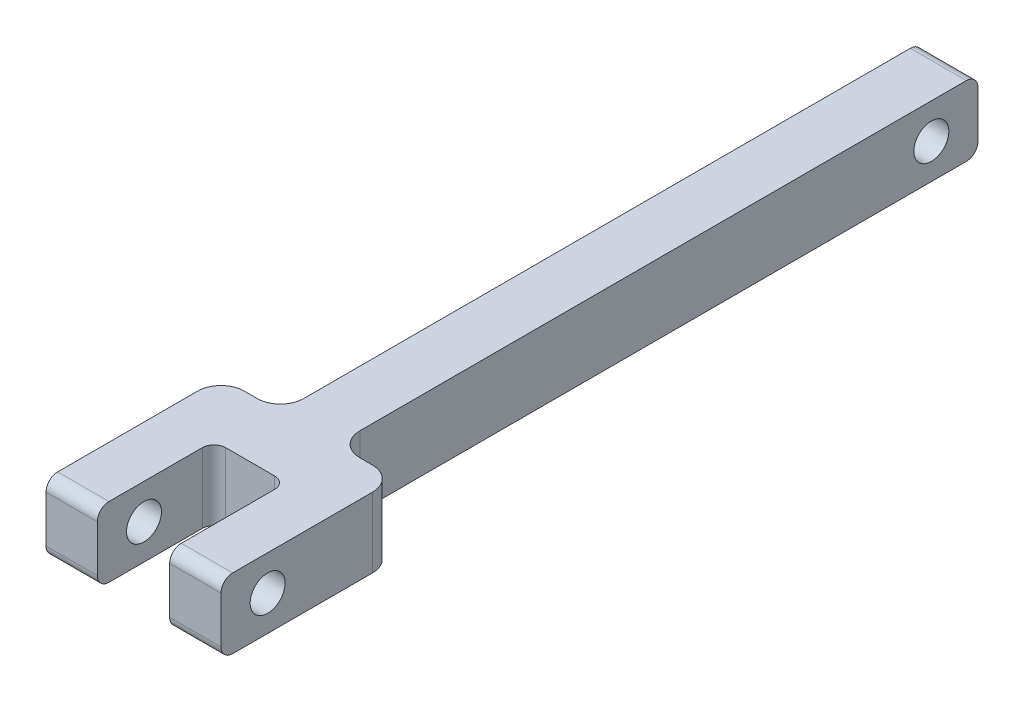
ISO-10303-21;
HEADER;
FILE_DESCRIPTION(('STEP AP214'),'2;1');
FILE_NAME('part.step','',(''),(''),'','','');
FILE_SCHEMA(('AUTOMOTIVE_DESIGN { 1 0 10303 214 1 1 1 1 }'));
ENDSEC;
DATA;
#1=APPLICATION_CONTEXT('core data for automotive mechanical design processes');
#2=APPLICATION_PROTOCOL_DEFINITION('international standard','automotive_design',2000,#1);
#3=PRODUCT_CONTEXT('',#1,'mechanical');
#4=PRODUCT('Part','Part','',(#3));
#5=PRODUCT_RELATED_PRODUCT_CATEGORY('part','',(#4));
#6=PRODUCT_DEFINITION_FORMATION('','',#4);
#7=PRODUCT_DEFINITION_CONTEXT('part definition',#1,'design');
#8=PRODUCT_DEFINITION('design','',#6,#7);
#9=PRODUCT_DEFINITION_SHAPE('','',#8);
#10=(LENGTH_UNIT() NAMED_UNIT(*) SI_UNIT(.MILLI.,.METRE.));
#11=(NAMED_UNIT(*) PLANE_ANGLE_UNIT() SI_UNIT($,.RADIAN.));
#12=(NAMED_UNIT(*) SI_UNIT($,.STERADIAN.) SOLID_ANGLE_UNIT());
#13=UNCERTAINTY_MEASURE_WITH_UNIT(LENGTH_MEASURE(1.E-05),#10,'distance_accuracy_value','');
#14=(GEOMETRIC_REPRESENTATION_CONTEXT(3) GLOBAL_UNCERTAINTY_ASSIGNED_CONTEXT((#13)) GLOBAL_UNIT_ASSIGNED_CONTEXT((#10,
#11,#12)) REPRESENTATION_CONTEXT('',''));
#15=CARTESIAN_POINT('',(0.,0.,0.));
#16=DIRECTION('',(0.,0.,1.));
#17=DIRECTION('',(1.,0.,0.));
#18=AXIS2_PLACEMENT_3D('',#15,#16,#17);
#19=CARTESIAN_POINT('',(2.4,-2.,34.));
#20=DIRECTION('',(-1.,0.,0.));
#21=DIRECTION('',(0.,0.,1.));
#22=AXIS2_PLACEMENT_3D('',#19,#20,#21);
#23=CYLINDRICAL_SURFACE('',#22,1.);
#24=CARTESIAN_POINT('',(-3.1,-2.,34.));
#25=DIRECTION('',(1.,0.,0.));
#26=DIRECTION('',(0.,0.,-1.));
#27=AXIS2_PLACEMENT_3D('',#24,#25,#26);
#28=CIRCLE('',#27,1.);
#29=CARTESIAN_POINT('',(-3.1,-2.,35.));
#30=VERTEX_POINT('',#29);
#31=CARTESIAN_POINT('',(-3.1,-3.,34.));
#32=VERTEX_POINT('',#31);
#33=EDGE_CURVE('E214',#30,#32,#28,.T.);
#34=ORIENTED_EDGE('',*,*,#33,.F.);
#35=DIRECTION('',(-1.,0.,0.));
#36=VECTOR('',#35,1.);
#37=CARTESIAN_POINT('',(2.4,-2.,35.));
#38=LINE('',#37,#36);
#39=CARTESIAN_POINT('',(-7.5,-2.,35.));
#40=VERTEX_POINT('',#39);
#41=EDGE_CURVE('E213',#30,#40,#38,.T.);
#42=ORIENTED_EDGE('',*,*,#41,.T.);
#43=CARTESIAN_POINT('',(-7.5,-2.,34.));
#44=DIRECTION('',(1.,0.,0.));
#45=DIRECTION('',(0.,0.,-1.));
#46=AXIS2_PLACEMENT_3D('',#43,#44,#45);
#47=CIRCLE('',#46,1.);
#48=CARTESIAN_POINT('',(-7.5,-3.,34.));
#49=VERTEX_POINT('',#48);
#50=EDGE_CURVE('E359',#40,#49,#47,.T.);
#51=ORIENTED_EDGE('',*,*,#50,.T.);
#52=DIRECTION('',(-1.,0.,0.));
#53=VECTOR('',#52,1.);
#54=CARTESIAN_POINT('',(2.4,-3.,34.));
#55=LINE('',#54,#53);
#56=EDGE_CURVE('E244',#32,#49,#55,.T.);
#57=ORIENTED_EDGE('',*,*,#56,.F.);
#58=EDGE_LOOP('',(#34,#42,#51,#57));
#59=FACE_BOUND('',#58,.T.);
#60=ADVANCED_FACE('F33',(#59),#23,.T.);
#61=CARTESIAN_POINT('',(2.4,-3.,34.));
#62=DIRECTION('',(0.,1.,0.));
#63=DIRECTION('',(0.,0.,1.));
#64=AXIS2_PLACEMENT_3D('',#61,#62,#63);
#65=PLANE('',#64);
#66=DIRECTION('',(-1.,0.,0.));
#67=VECTOR('',#66,1.);
#68=CARTESIAN_POINT('',(7.5,-3.,20.));
#69=LINE('',#68,#67);
#70=CARTESIAN_POINT('',(5.5,-3.,20.));
#71=VERTEX_POINT('',#70);
#72=CARTESIAN_POINT('',(4.4,-3.,20.));
#73=VERTEX_POINT('',#72);
#74=EDGE_CURVE('E372',#71,#73,#69,.T.);
#75=ORIENTED_EDGE('',*,*,#74,.F.);
#76=CARTESIAN_POINT('',(5.5,-3.,22.));
#77=DIRECTION('',(0.,1.,0.));
#78=DIRECTION('',(0.,0.,1.));
#79=AXIS2_PLACEMENT_3D('',#76,#77,#78);
#80=CIRCLE('',#79,2.);
#81=CARTESIAN_POINT('',(7.5,-3.,22.));
#82=VERTEX_POINT('',#81);
#83=EDGE_CURVE('E269',#71,#82,#80,.F.);
#84=ORIENTED_EDGE('',*,*,#83,.T.);
#85=DIRECTION('',(0.,0.,-1.));
#86=VECTOR('',#85,1.);
#87=CARTESIAN_POINT('',(7.5,-3.,20.));
#88=LINE('',#87,#86);
#89=CARTESIAN_POINT('',(7.5,-3.,34.));
#90=VERTEX_POINT('',#89);
#91=EDGE_CURVE('E350',#90,#82,#88,.T.);
#92=ORIENTED_EDGE('',*,*,#91,.F.);
#93=CARTESIAN_POINT('',(3.1,-3.,34.));
#94=VERTEX_POINT('',#93);
#95=EDGE_CURVE('E245',#90,#94,#55,.T.);
#96=ORIENTED_EDGE('',*,*,#95,.T.);
#97=DIRECTION('',(0.,0.,-1.));
#98=VECTOR('',#97,1.);
#99=CARTESIAN_POINT('',(3.1,-3.,25.));
#100=LINE('',#99,#98);
#101=CARTESIAN_POINT('',(3.1,-3.,26.));
#102=VERTEX_POINT('',#101);
#103=EDGE_CURVE('E330',#94,#102,#100,.T.);
#104=ORIENTED_EDGE('',*,*,#103,.T.);
#105=CARTESIAN_POINT('',(2.1,-3.,26.));
#106=DIRECTION('',(0.,1.,0.));
#107=DIRECTION('',(0.,0.,1.));
#108=AXIS2_PLACEMENT_3D('',#105,#106,#107);
#109=CIRCLE('',#108,1.);
#110=CARTESIAN_POINT('',(2.1,-3.,25.));
#111=VERTEX_POINT('',#110);
#112=EDGE_CURVE('E303',#102,#111,#109,.T.);
#113=ORIENTED_EDGE('',*,*,#112,.T.);
#114=DIRECTION('',(1.,0.,0.));
#115=VECTOR('',#114,1.);
#116=CARTESIAN_POINT('',(-3.1,-3.,25.));
#117=LINE('',#116,#115);
#118=CARTESIAN_POINT('',(-2.1,-3.,25.));
#119=VERTEX_POINT('',#118);
#120=EDGE_CURVE('E313',#119,#111,#117,.T.);
#121=ORIENTED_EDGE('',*,*,#120,.F.);
#122=CARTESIAN_POINT('',(-2.1,-3.,26.));
#123=DIRECTION('',(0.,1.,0.));
#124=DIRECTION('',(0.,0.,1.));
#125=AXIS2_PLACEMENT_3D('',#122,#123,#124);
#126=CIRCLE('',#125,1.);
#127=CARTESIAN_POINT('',(-3.1,-3.,26.));
#128=VERTEX_POINT('',#127);
#129=EDGE_CURVE('E11',#119,#128,#126,.T.);
#130=ORIENTED_EDGE('',*,*,#129,.T.);
#131=DIRECTION('',(0.,0.,-1.));
#132=VECTOR('',#131,1.);
#133=CARTESIAN_POINT('',(-3.1,-3.,25.));
#134=LINE('',#133,#132);
#135=EDGE_CURVE('E315',#32,#128,#134,.T.);
#136=ORIENTED_EDGE('',*,*,#135,.F.);
#137=ORIENTED_EDGE('',*,*,#56,.T.);
#138=DIRECTION('',(0.,0.,-1.));
#139=VECTOR('',#138,1.);
#140=CARTESIAN_POINT('',(-7.5,-3.,20.));
#141=LINE('',#140,#139);
#142=CARTESIAN_POINT('',(-7.5,-3.,22.));
#143=VERTEX_POINT('',#142);
#144=EDGE_CURVE('E362',#49,#143,#141,.T.);
#145=ORIENTED_EDGE('',*,*,#144,.T.);
#146=CARTESIAN_POINT('',(-5.5,-3.,22.));
#147=DIRECTION('',(0.,1.,0.));
#148=DIRECTION('',(0.,0.,1.));
#149=AXIS2_PLACEMENT_3D('',#146,#147,#148);
#150=CIRCLE('',#149,2.);
#151=CARTESIAN_POINT('',(-5.5,-3.,20.));
#152=VERTEX_POINT('',#151);
#153=EDGE_CURVE('E267',#143,#152,#150,.F.);
#154=ORIENTED_EDGE('',*,*,#153,.T.);
#155=CARTESIAN_POINT('',(-4.4,-3.,20.));
#156=VERTEX_POINT('',#155);
#157=EDGE_CURVE('E369',#156,#152,#69,.T.);
#158=ORIENTED_EDGE('',*,*,#157,.F.);
#159=CARTESIAN_POINT('',(-4.4,-3.,18.));
#160=DIRECTION('',(0.,1.,0.));
#161=DIRECTION('',(0.,0.,1.));
#162=AXIS2_PLACEMENT_3D('',#159,#160,#161);
#163=CIRCLE('',#162,2.);
#164=CARTESIAN_POINT('',(-2.4,-3.,18.));
#165=VERTEX_POINT('',#164);
#166=EDGE_CURVE('E288',#156,#165,#163,.T.);
#167=ORIENTED_EDGE('',*,*,#166,.T.);
#168=DIRECTION('',(0.,0.,-1.));
#169=VECTOR('',#168,1.);
#170=CARTESIAN_POINT('',(-2.4,-3.,34.));
#171=LINE('',#170,#169);
#172=CARTESIAN_POINT('',(-2.4,-3.,-34.));
#173=VERTEX_POINT('',#172);
#174=EDGE_CURVE('E379',#165,#173,#171,.T.);
#175=ORIENTED_EDGE('',*,*,#174,.T.);
#176=DIRECTION('',(-1.,0.,0.));
#177=VECTOR('',#176,1.);
#178=CARTESIAN_POINT('',(2.4,-3.,-34.));
#179=LINE('',#178,#177);
#180=CARTESIAN_POINT('',(2.4,-3.,-34.));
#181=VERTEX_POINT('',#180);
#182=EDGE_CURVE('E241',#181,#173,#179,.T.);
#183=ORIENTED_EDGE('',*,*,#182,.F.);
#184=DIRECTION('',(0.,0.,-1.));
#185=VECTOR('',#184,1.);
#186=CARTESIAN_POINT('',(2.4,-3.,34.));
#187=LINE('',#186,#185);
#188=CARTESIAN_POINT('',(2.4,-3.,18.));
#189=VERTEX_POINT('',#188);
#190=EDGE_CURVE('E380',#189,#181,#187,.T.);
#191=ORIENTED_EDGE('',*,*,#190,.F.);
#192=CARTESIAN_POINT('',(4.4,-3.,18.));
#193=DIRECTION('',(0.,1.,0.));
#194=DIRECTION('',(0.,0.,1.));
#195=AXIS2_PLACEMENT_3D('',#192,#193,#194);
#196=CIRCLE('',#195,2.);
#197=EDGE_CURVE('E284',#189,#73,#196,.T.);
#198=ORIENTED_EDGE('',*,*,#197,.T.);
#199=EDGE_LOOP('',(#75,#84,#92,#96,#104,#113,#121,#130,#136,#137,#145,#154,#158,#167,#175,#183,
#191,#198));
#200=FACE_BOUND('',#199,.T.);
#201=ADVANCED_FACE('F415',(#200),#65,.F.);
#202=CARTESIAN_POINT('',(2.4,3.,34.));
#203=DIRECTION('',(0.,-1.,0.));
#204=DIRECTION('',(0.,0.,-1.));
#205=AXIS2_PLACEMENT_3D('',#202,#203,#204);
#206=PLANE('',#205);
#207=DIRECTION('',(0.,0.,1.));
#208=VECTOR('',#207,1.);
#209=CARTESIAN_POINT('',(7.5,3.,34.));
#210=LINE('',#209,#208);
#211=CARTESIAN_POINT('',(7.5,3.,22.));
#212=VERTEX_POINT('',#211);
#213=CARTESIAN_POINT('',(7.5,3.,34.));
#214=VERTEX_POINT('',#213);
#215=EDGE_CURVE('E353',#212,#214,#210,.T.);
#216=ORIENTED_EDGE('',*,*,#215,.F.);
#217=CARTESIAN_POINT('',(5.5,3.,22.));
#218=DIRECTION('',(0.,-1.,0.));
#219=DIRECTION('',(0.,0.,-1.));
#220=AXIS2_PLACEMENT_3D('',#217,#218,#219);
#221=CIRCLE('',#220,2.);
#222=CARTESIAN_POINT('',(5.5,3.,20.));
#223=VERTEX_POINT('',#222);
#224=EDGE_CURVE('E261',#212,#223,#221,.F.);
#225=ORIENTED_EDGE('',*,*,#224,.T.);
#226=DIRECTION('',(-1.,0.,0.));
#227=VECTOR('',#226,1.);
#228=CARTESIAN_POINT('',(7.5,3.,20.));
#229=LINE('',#228,#227);
#230=CARTESIAN_POINT('',(4.4,3.,20.));
#231=VERTEX_POINT('',#230);
#232=EDGE_CURVE('E368',#223,#231,#229,.T.);
#233=ORIENTED_EDGE('',*,*,#232,.T.);
#234=CARTESIAN_POINT('',(4.4,3.,18.));
#235=DIRECTION('',(0.,-1.,0.));
#236=DIRECTION('',(0.,0.,-1.));
#237=AXIS2_PLACEMENT_3D('',#234,#235,#236);
#238=CIRCLE('',#237,2.);
#239=CARTESIAN_POINT('',(2.4,3.,18.));
#240=VERTEX_POINT('',#239);
#241=EDGE_CURVE('E286',#231,#240,#238,.T.);
#242=ORIENTED_EDGE('',*,*,#241,.T.);
#243=DIRECTION('',(0.,0.,1.));
#244=VECTOR('',#243,1.);
#245=CARTESIAN_POINT('',(2.4,3.,34.));
#246=LINE('',#245,#244);
#247=CARTESIAN_POINT('',(2.4,3.,-34.));
#248=VERTEX_POINT('',#247);
#249=EDGE_CURVE('E389',#248,#240,#246,.T.);
#250=ORIENTED_EDGE('',*,*,#249,.F.);
#251=DIRECTION('',(-1.,0.,0.));
#252=VECTOR('',#251,1.);
#253=CARTESIAN_POINT('',(2.4,3.,-34.));
#254=LINE('',#253,#252);
#255=CARTESIAN_POINT('',(-2.4,3.,-34.));
#256=VERTEX_POINT('',#255);
#257=EDGE_CURVE('E232',#248,#256,#254,.T.);
#258=ORIENTED_EDGE('',*,*,#257,.T.);
#259=DIRECTION('',(0.,0.,1.));
#260=VECTOR('',#259,1.);
#261=CARTESIAN_POINT('',(-2.4,3.,34.));
#262=LINE('',#261,#260);
#263=CARTESIAN_POINT('',(-2.4,3.,18.));
#264=VERTEX_POINT('',#263);
#265=EDGE_CURVE('E383',#256,#264,#262,.T.);
#266=ORIENTED_EDGE('',*,*,#265,.T.);
#267=CARTESIAN_POINT('',(-4.4,3.,18.));
#268=DIRECTION('',(0.,-1.,0.));
#269=DIRECTION('',(0.,0.,-1.));
#270=AXIS2_PLACEMENT_3D('',#267,#268,#269);
#271=CIRCLE('',#270,2.);
#272=CARTESIAN_POINT('',(-4.4,3.,20.));
#273=VERTEX_POINT('',#272);
#274=EDGE_CURVE('E290',#264,#273,#271,.T.);
#275=ORIENTED_EDGE('',*,*,#274,.T.);
#276=CARTESIAN_POINT('',(-5.5,3.,20.));
#277=VERTEX_POINT('',#276);
#278=EDGE_CURVE('E355',#273,#277,#229,.T.);
#279=ORIENTED_EDGE('',*,*,#278,.T.);
#280=CARTESIAN_POINT('',(-5.5,3.,22.));
#281=DIRECTION('',(0.,-1.,0.));
#282=DIRECTION('',(0.,0.,-1.));
#283=AXIS2_PLACEMENT_3D('',#280,#281,#282);
#284=CIRCLE('',#283,2.);
#285=CARTESIAN_POINT('',(-7.5,3.,22.));
#286=VERTEX_POINT('',#285);
#287=EDGE_CURVE('E259',#277,#286,#284,.F.);
#288=ORIENTED_EDGE('',*,*,#287,.T.);
#289=DIRECTION('',(0.,0.,1.));
#290=VECTOR('',#289,1.);
#291=CARTESIAN_POINT('',(-7.5,3.,34.));
#292=LINE('',#291,#290);
#293=CARTESIAN_POINT('',(-7.5,3.,34.));
#294=VERTEX_POINT('',#293);
#295=EDGE_CURVE('E344',#286,#294,#292,.T.);
#296=ORIENTED_EDGE('',*,*,#295,.T.);
#297=DIRECTION('',(-1.,0.,0.));
#298=VECTOR('',#297,1.);
#299=CARTESIAN_POINT('',(2.4,3.,34.));
#300=LINE('',#299,#298);
#301=CARTESIAN_POINT('',(-3.1,3.,34.));
#302=VERTEX_POINT('',#301);
#303=EDGE_CURVE('E224',#302,#294,#300,.T.);
#304=ORIENTED_EDGE('',*,*,#303,.F.);
#305=DIRECTION('',(0.,0.,1.));
#306=VECTOR('',#305,1.);
#307=CARTESIAN_POINT('',(-3.1,3.,34.));
#308=LINE('',#307,#306);
#309=CARTESIAN_POINT('',(-3.1,3.,26.));
#310=VERTEX_POINT('',#309);
#311=EDGE_CURVE('E200',#310,#302,#308,.T.);
#312=ORIENTED_EDGE('',*,*,#311,.F.);
#313=CARTESIAN_POINT('',(-2.1,3.,26.));
#314=DIRECTION('',(0.,-1.,0.));
#315=DIRECTION('',(0.,0.,-1.));
#316=AXIS2_PLACEMENT_3D('',#313,#314,#315);
#317=CIRCLE('',#316,1.);
#318=CARTESIAN_POINT('',(-2.1,3.,25.));
#319=VERTEX_POINT('',#318);
#320=EDGE_CURVE('E41',#310,#319,#317,.T.);
#321=ORIENTED_EDGE('',*,*,#320,.T.);
#322=DIRECTION('',(1.,0.,0.));
#323=VECTOR('',#322,1.);
#324=CARTESIAN_POINT('',(-3.1,3.,25.));
#325=LINE('',#324,#323);
#326=CARTESIAN_POINT('',(2.1,3.,25.));
#327=VERTEX_POINT('',#326);
#328=EDGE_CURVE('E253',#319,#327,#325,.T.);
#329=ORIENTED_EDGE('',*,*,#328,.T.);
#330=CARTESIAN_POINT('',(2.1,3.,26.));
#331=DIRECTION('',(0.,-1.,0.));
#332=DIRECTION('',(0.,0.,-1.));
#333=AXIS2_PLACEMENT_3D('',#330,#331,#332);
#334=CIRCLE('',#333,1.);
#335=CARTESIAN_POINT('',(3.1,3.,26.));
#336=VERTEX_POINT('',#335);
#337=EDGE_CURVE('E301',#327,#336,#334,.T.);
#338=ORIENTED_EDGE('',*,*,#337,.T.);
#339=DIRECTION('',(0.,0.,1.));
#340=VECTOR('',#339,1.);
#341=CARTESIAN_POINT('',(3.1,3.,34.));
#342=LINE('',#341,#340);
#343=CARTESIAN_POINT('',(3.1,3.,34.));
#344=VERTEX_POINT('',#343);
#345=EDGE_CURVE('E205',#336,#344,#342,.T.);
#346=ORIENTED_EDGE('',*,*,#345,.T.);
#347=EDGE_CURVE('E229',#214,#344,#300,.T.);
#348=ORIENTED_EDGE('',*,*,#347,.F.);
#349=EDGE_LOOP('',(#216,#225,#233,#242,#250,#258,#266,#275,#279,#288,#296,#304,#312,#321,#329,
#338,#346,#348));
#350=FACE_BOUND('',#349,.T.);
#351=ADVANCED_FACE('F308',(#350),#206,.F.);
#352=CARTESIAN_POINT('',(2.4,2.,34.));
#353=DIRECTION('',(-1.,0.,0.));
#354=DIRECTION('',(0.,0.,1.));
#355=AXIS2_PLACEMENT_3D('',#352,#353,#354);
#356=CYLINDRICAL_SURFACE('',#355,1.);
#357=CARTESIAN_POINT('',(-3.1,2.,34.));
#358=DIRECTION('',(1.,0.,0.));
#359=DIRECTION('',(0.,0.,-1.));
#360=AXIS2_PLACEMENT_3D('',#357,#358,#359);
#361=CIRCLE('',#360,1.);
#362=CARTESIAN_POINT('',(-3.1,2.,35.));
#363=VERTEX_POINT('',#362);
#364=EDGE_CURVE('E193',#302,#363,#361,.T.);
#365=ORIENTED_EDGE('',*,*,#364,.F.);
#366=ORIENTED_EDGE('',*,*,#303,.T.);
#367=CARTESIAN_POINT('',(-7.5,2.,34.));
#368=DIRECTION('',(1.,0.,0.));
#369=DIRECTION('',(0.,0.,-1.));
#370=AXIS2_PLACEMENT_3D('',#367,#368,#369);
#371=CIRCLE('',#370,1.);
#372=CARTESIAN_POINT('',(-7.5,2.,35.));
#373=VERTEX_POINT('',#372);
#374=EDGE_CURVE('E219',#294,#373,#371,.T.);
#375=ORIENTED_EDGE('',*,*,#374,.T.);
#376=DIRECTION('',(-1.,0.,0.));
#377=VECTOR('',#376,1.);
#378=CARTESIAN_POINT('',(2.4,2.,35.));
#379=LINE('',#378,#377);
#380=EDGE_CURVE('E211',#363,#373,#379,.T.);
#381=ORIENTED_EDGE('',*,*,#380,.F.);
#382=EDGE_LOOP('',(#365,#366,#375,#381));
#383=FACE_BOUND('',#382,.T.);
#384=ADVANCED_FACE('F217',(#383),#356,.T.);
#385=CARTESIAN_POINT('',(2.4,2.,35.));
#386=DIRECTION('',(0.,0.,-1.));
#387=DIRECTION('',(-1.,0.,0.));
#388=AXIS2_PLACEMENT_3D('',#385,#386,#387);
#389=PLANE('',#388);
#390=DIRECTION('',(0.,-1.,0.));
#391=VECTOR('',#390,1.);
#392=CARTESIAN_POINT('',(-3.1,2.,35.));
#393=LINE('',#392,#391);
#394=EDGE_CURVE('E197',#363,#30,#393,.T.);
#395=ORIENTED_EDGE('',*,*,#394,.F.);
#396=ORIENTED_EDGE('',*,*,#380,.T.);
#397=DIRECTION('',(0.,-1.,0.));
#398=VECTOR('',#397,1.);
#399=CARTESIAN_POINT('',(-7.5,2.,35.));
#400=LINE('',#399,#398);
#401=EDGE_CURVE('E357',#373,#40,#400,.T.);
#402=ORIENTED_EDGE('',*,*,#401,.T.);
#403=ORIENTED_EDGE('',*,*,#41,.F.);
#404=EDGE_LOOP('',(#395,#396,#402,#403));
#405=FACE_BOUND('',#404,.T.);
#406=ADVANCED_FACE('F209',(#405),#389,.F.);
#407=CARTESIAN_POINT('',(-2.4,0.,31.));
#408=DIRECTION('',(1.,0.,0.));
#409=DIRECTION('',(0.,0.,-1.));
#410=AXIS2_PLACEMENT_3D('',#407,#408,#409);
#411=CYLINDRICAL_SURFACE('',#410,1.5);
#412=CARTESIAN_POINT('',(-7.5,0.,31.));
#413=DIRECTION('',(1.,0.,0.));
#414=DIRECTION('',(0.,0.,-1.));
#415=AXIS2_PLACEMENT_3D('',#412,#413,#414);
#416=CIRCLE('',#415,1.5);
#417=CARTESIAN_POINT('',(-7.5,0.,29.5));
#418=VERTEX_POINT('',#417);
#419=EDGE_CURVE('E256',#418,#418,#416,.T.);
#420=ORIENTED_EDGE('',*,*,#419,.F.);
#421=EDGE_LOOP('',(#420));
#422=FACE_BOUND('',#421,.T.);
#423=CARTESIAN_POINT('',(-3.1,0.,31.));
#424=DIRECTION('',(1.,0.,0.));
#425=DIRECTION('',(0.,0.,-1.));
#426=AXIS2_PLACEMENT_3D('',#423,#424,#425);
#427=CIRCLE('',#426,1.5);
#428=CARTESIAN_POINT('',(-3.1,0.,29.5));
#429=VERTEX_POINT('',#428);
#430=EDGE_CURVE('E252',#429,#429,#427,.F.);
#431=ORIENTED_EDGE('',*,*,#430,.F.);
#432=EDGE_LOOP('',(#431));
#433=FACE_BOUND('',#432,.T.);
#434=ADVANCED_FACE('F515',(#422,#433),#411,.F.);
#435=CARTESIAN_POINT('',(2.4,-2.,34.));
#436=DIRECTION('',(1.,0.,0.));
#437=DIRECTION('',(0.,0.,-1.));
#438=AXIS2_PLACEMENT_3D('',#435,#436,#437);
#439=PLANE('',#438);
#440=CARTESIAN_POINT('',(2.4,0.,-31.));
#441=DIRECTION('',(1.,0.,0.));
#442=DIRECTION('',(0.,0.,-1.));
#443=AXIS2_PLACEMENT_3D('',#440,#441,#442);
#444=CIRCLE('',#443,1.50000000000001);
#445=CARTESIAN_POINT('',(2.4,0.,-32.5));
#446=VERTEX_POINT('',#445);
#447=EDGE_CURVE('E373',#446,#446,#444,.T.);
#448=ORIENTED_EDGE('',*,*,#447,.F.);
#449=EDGE_LOOP('',(#448));
#450=FACE_BOUND('',#449,.T.);
#451=ORIENTED_EDGE('',*,*,#249,.T.);
#452=DIRECTION('',(0.,-1.,0.));
#453=VECTOR('',#452,1.);
#454=CARTESIAN_POINT('',(2.4,-2.,18.));
#455=LINE('',#454,#453);
#456=EDGE_CURVE('E279',#240,#189,#455,.T.);
#457=ORIENTED_EDGE('',*,*,#456,.T.);
#458=ORIENTED_EDGE('',*,*,#190,.T.);
#459=CARTESIAN_POINT('',(2.4,-2.,-34.));
#460=DIRECTION('',(1.,0.,0.));
#461=DIRECTION('',(0.,0.,-1.));
#462=AXIS2_PLACEMENT_3D('',#459,#460,#461);
#463=CIRCLE('',#462,1.);
#464=CARTESIAN_POINT('',(2.4,-2.,-35.));
#465=VERTEX_POINT('',#464);
#466=EDGE_CURVE('E382',#181,#465,#463,.T.);
#467=ORIENTED_EDGE('',*,*,#466,.T.);
#468=DIRECTION('',(0.,1.,0.));
#469=VECTOR('',#468,1.);
#470=CARTESIAN_POINT('',(2.4,2.,-35.));
#471=LINE('',#470,#469);
#472=CARTESIAN_POINT('',(2.4,2.,-35.));
#473=VERTEX_POINT('',#472);
#474=EDGE_CURVE('E385',#465,#473,#471,.T.);
#475=ORIENTED_EDGE('',*,*,#474,.T.);
#476=CARTESIAN_POINT('',(2.4,2.,-34.));
#477=DIRECTION('',(1.,0.,0.));
#478=DIRECTION('',(0.,0.,1.));
#479=AXIS2_PLACEMENT_3D('',#476,#477,#478);
#480=CIRCLE('',#479,1.);
#481=EDGE_CURVE('E387',#473,#248,#480,.T.);
#482=ORIENTED_EDGE('',*,*,#481,.T.);
#483=EDGE_LOOP('',(#451,#457,#458,#467,#475,#482));
#484=FACE_BOUND('',#483,.T.);
#485=ADVANCED_FACE('F447',(#450,#484),#439,.T.);
#486=CARTESIAN_POINT('',(-2.4,-2.,34.));
#487=DIRECTION('',(1.,0.,0.));
#488=DIRECTION('',(0.,0.,-1.));
#489=AXIS2_PLACEMENT_3D('',#486,#487,#488);
#490=PLANE('',#489);
#491=CARTESIAN_POINT('',(-2.4,0.,-31.));
#492=DIRECTION('',(1.,0.,0.));
#493=DIRECTION('',(0.,0.,-1.));
#494=AXIS2_PLACEMENT_3D('',#491,#492,#493);
#495=CIRCLE('',#494,1.50000000000001);
#496=CARTESIAN_POINT('',(-2.4,0.,-32.5));
#497=VERTEX_POINT('',#496);
#498=EDGE_CURVE('E376',#497,#497,#495,.T.);
#499=ORIENTED_EDGE('',*,*,#498,.T.);
#500=EDGE_LOOP('',(#499));
#501=FACE_BOUND('',#500,.T.);
#502=ORIENTED_EDGE('',*,*,#174,.F.);
#503=DIRECTION('',(0.,-1.,0.));
#504=VECTOR('',#503,1.);
#505=CARTESIAN_POINT('',(-2.4,3.,18.));
#506=LINE('',#505,#504);
#507=EDGE_CURVE('E282',#165,#264,#506,.F.);
#508=ORIENTED_EDGE('',*,*,#507,.T.);
#509=ORIENTED_EDGE('',*,*,#265,.F.);
#510=CARTESIAN_POINT('',(-2.4,2.,-34.));
#511=DIRECTION('',(1.,0.,0.));
#512=DIRECTION('',(0.,0.,1.));
#513=AXIS2_PLACEMENT_3D('',#510,#511,#512);
#514=CIRCLE('',#513,1.);
#515=CARTESIAN_POINT('',(-2.4,2.,-35.));
#516=VERTEX_POINT('',#515);
#517=EDGE_CURVE('E397',#516,#256,#514,.T.);
#518=ORIENTED_EDGE('',*,*,#517,.F.);
#519=DIRECTION('',(0.,1.,0.));
#520=VECTOR('',#519,1.);
#521=CARTESIAN_POINT('',(-2.4,2.,-35.));
#522=LINE('',#521,#520);
#523=CARTESIAN_POINT('',(-2.4,-2.,-35.));
#524=VERTEX_POINT('',#523);
#525=EDGE_CURVE('E395',#524,#516,#522,.T.);
#526=ORIENTED_EDGE('',*,*,#525,.F.);
#527=CARTESIAN_POINT('',(-2.4,-2.,-34.));
#528=DIRECTION('',(1.,0.,0.));
#529=DIRECTION('',(0.,0.,-1.));
#530=AXIS2_PLACEMENT_3D('',#527,#528,#529);
#531=CIRCLE('',#530,1.);
#532=EDGE_CURVE('E393',#173,#524,#531,.T.);
#533=ORIENTED_EDGE('',*,*,#532,.F.);
#534=EDGE_LOOP('',(#502,#508,#509,#518,#526,#533));
#535=FACE_BOUND('',#534,.T.);
#536=ADVANCED_FACE('F438',(#501,#535),#490,.F.);
#537=CARTESIAN_POINT('',(7.5,-2.,35.));
#538=VERTEX_POINT('',#537);
#539=CARTESIAN_POINT('',(3.1,-2.,35.));
#540=VERTEX_POINT('',#539);
#541=EDGE_CURVE('E221',#538,#540,#38,.T.);
#542=ORIENTED_EDGE('',*,*,#541,.T.);
#543=CARTESIAN_POINT('',(3.1,-2.,34.));
#544=DIRECTION('',(1.,0.,0.));
#545=DIRECTION('',(0.,0.,-1.));
#546=AXIS2_PLACEMENT_3D('',#543,#544,#545);
#547=CIRCLE('',#546,1.);
#548=EDGE_CURVE('E327',#540,#94,#547,.T.);
#549=ORIENTED_EDGE('',*,*,#548,.T.);
#550=ORIENTED_EDGE('',*,*,#95,.F.);
#551=CARTESIAN_POINT('',(7.5,-2.,34.));
#552=DIRECTION('',(1.,0.,0.));
#553=DIRECTION('',(0.,0.,-1.));
#554=AXIS2_PLACEMENT_3D('',#551,#552,#553);
#555=CIRCLE('',#554,1.);
#556=EDGE_CURVE('E347',#538,#90,#555,.T.);
#557=ORIENTED_EDGE('',*,*,#556,.F.);
#558=EDGE_LOOP('',(#542,#549,#550,#557));
#559=FACE_BOUND('',#558,.T.);
#560=ADVANCED_FACE('F430',(#559),#23,.T.);
#561=CARTESIAN_POINT('',(2.4,-2.,-34.));
#562=DIRECTION('',(-1.,0.,0.));
#563=DIRECTION('',(0.,0.,1.));
#564=AXIS2_PLACEMENT_3D('',#561,#562,#563);
#565=CYLINDRICAL_SURFACE('',#564,1.);
#566=ORIENTED_EDGE('',*,*,#532,.T.);
#567=DIRECTION('',(-1.,0.,0.));
#568=VECTOR('',#567,1.);
#569=CARTESIAN_POINT('',(2.4,-2.,-35.));
#570=LINE('',#569,#568);
#571=EDGE_CURVE('E238',#465,#524,#570,.T.);
#572=ORIENTED_EDGE('',*,*,#571,.F.);
#573=ORIENTED_EDGE('',*,*,#466,.F.);
#574=ORIENTED_EDGE('',*,*,#182,.T.);
#575=EDGE_LOOP('',(#566,#572,#573,#574));
#576=FACE_BOUND('',#575,.T.);
#577=ADVANCED_FACE('F437',(#576),#565,.T.);
#578=CARTESIAN_POINT('',(2.4,2.,-35.));
#579=DIRECTION('',(0.,0.,1.));
#580=DIRECTION('',(1.,0.,0.));
#581=AXIS2_PLACEMENT_3D('',#578,#579,#580);
#582=PLANE('',#581);
#583=ORIENTED_EDGE('',*,*,#525,.T.);
#584=DIRECTION('',(-1.,0.,0.));
#585=VECTOR('',#584,1.);
#586=CARTESIAN_POINT('',(2.4,2.,-35.));
#587=LINE('',#586,#585);
#588=EDGE_CURVE('E235',#473,#516,#587,.T.);
#589=ORIENTED_EDGE('',*,*,#588,.F.);
#590=ORIENTED_EDGE('',*,*,#474,.F.);
#591=ORIENTED_EDGE('',*,*,#571,.T.);
#592=EDGE_LOOP('',(#583,#589,#590,#591));
#593=FACE_BOUND('',#592,.T.);
#594=ADVANCED_FACE('F444',(#593),#582,.F.);
#595=CARTESIAN_POINT('',(2.4,2.,-34.));
#596=DIRECTION('',(-1.,0.,0.));
#597=DIRECTION('',(0.,0.,1.));
#598=AXIS2_PLACEMENT_3D('',#595,#596,#597);
#599=CYLINDRICAL_SURFACE('',#598,1.);
#600=ORIENTED_EDGE('',*,*,#517,.T.);
#601=ORIENTED_EDGE('',*,*,#257,.F.);
#602=ORIENTED_EDGE('',*,*,#481,.F.);
#603=ORIENTED_EDGE('',*,*,#588,.T.);
#604=EDGE_LOOP('',(#600,#601,#602,#603));
#605=FACE_BOUND('',#604,.T.);
#606=ADVANCED_FACE('F492',(#605),#599,.T.);
#607=ORIENTED_EDGE('',*,*,#347,.T.);
#608=CARTESIAN_POINT('',(3.1,2.,34.));
#609=DIRECTION('',(1.,0.,0.));
#610=DIRECTION('',(0.,0.,-1.));
#611=AXIS2_PLACEMENT_3D('',#608,#609,#610);
#612=CIRCLE('',#611,1.);
#613=CARTESIAN_POINT('',(3.1,2.,35.));
#614=VERTEX_POINT('',#613);
#615=EDGE_CURVE('E321',#344,#614,#612,.T.);
#616=ORIENTED_EDGE('',*,*,#615,.T.);
#617=CARTESIAN_POINT('',(7.5,2.,35.));
#618=VERTEX_POINT('',#617);
#619=EDGE_CURVE('E220',#618,#614,#379,.T.);
#620=ORIENTED_EDGE('',*,*,#619,.F.);
#621=CARTESIAN_POINT('',(7.5,2.,34.));
#622=DIRECTION('',(1.,0.,0.));
#623=DIRECTION('',(0.,0.,-1.));
#624=AXIS2_PLACEMENT_3D('',#621,#622,#623);
#625=CIRCLE('',#624,1.);
#626=EDGE_CURVE('E340',#214,#618,#625,.T.);
#627=ORIENTED_EDGE('',*,*,#626,.F.);
#628=EDGE_LOOP('',(#607,#616,#620,#627));
#629=FACE_BOUND('',#628,.T.);
#630=ADVANCED_FACE('F461',(#629),#356,.T.);
#631=ORIENTED_EDGE('',*,*,#619,.T.);
#632=DIRECTION('',(0.,-1.,0.));
#633=VECTOR('',#632,1.);
#634=CARTESIAN_POINT('',(3.1,2.,35.));
#635=LINE('',#634,#633);
#636=EDGE_CURVE('E324',#614,#540,#635,.T.);
#637=ORIENTED_EDGE('',*,*,#636,.T.);
#638=ORIENTED_EDGE('',*,*,#541,.F.);
#639=DIRECTION('',(0.,-1.,0.));
#640=VECTOR('',#639,1.);
#641=CARTESIAN_POINT('',(7.5,2.,35.));
#642=LINE('',#641,#640);
#643=EDGE_CURVE('E343',#618,#538,#642,.T.);
#644=ORIENTED_EDGE('',*,*,#643,.F.);
#645=EDGE_LOOP('',(#631,#637,#638,#644));
#646=FACE_BOUND('',#645,.T.);
#647=ADVANCED_FACE('F453',(#646),#389,.F.);
#648=CARTESIAN_POINT('',(-2.4,0.,-31.));
#649=DIRECTION('',(1.,0.,0.));
#650=DIRECTION('',(0.,0.,-1.));
#651=AXIS2_PLACEMENT_3D('',#648,#649,#650);
#652=CYLINDRICAL_SURFACE('',#651,1.50000000000001);
#653=ORIENTED_EDGE('',*,*,#498,.F.);
#654=EDGE_LOOP('',(#653));
#655=FACE_BOUND('',#654,.T.);
#656=ORIENTED_EDGE('',*,*,#447,.T.);
#657=EDGE_LOOP('',(#656));
#658=FACE_BOUND('',#657,.T.);
#659=ADVANCED_FACE('F511',(#655,#658),#652,.F.);
#660=CARTESIAN_POINT('',(7.5,3.,20.));
#661=DIRECTION('',(0.,0.,1.));
#662=DIRECTION('',(1.,0.,0.));
#663=AXIS2_PLACEMENT_3D('',#660,#661,#662);
#664=PLANE('',#663);
#665=ORIENTED_EDGE('',*,*,#157,.T.);
#666=DIRECTION('',(0.,1.,0.));
#667=VECTOR('',#666,1.);
#668=CARTESIAN_POINT('',(-5.5,3.,20.));
#669=LINE('',#668,#667);
#670=EDGE_CURVE('E274',#152,#277,#669,.T.);
#671=ORIENTED_EDGE('',*,*,#670,.T.);
#672=ORIENTED_EDGE('',*,*,#278,.F.);
#673=DIRECTION('',(0.,-1.,0.));
#674=VECTOR('',#673,1.);
#675=CARTESIAN_POINT('',(-4.4,-3.,20.));
#676=LINE('',#675,#674);
#677=EDGE_CURVE('E271',#273,#156,#676,.T.);
#678=ORIENTED_EDGE('',*,*,#677,.T.);
#679=EDGE_LOOP('',(#665,#671,#672,#678));
#680=FACE_BOUND('',#679,.T.);
#681=ADVANCED_FACE('F412',(#680),#664,.F.);
#682=CARTESIAN_POINT('',(-7.5,2.,34.));
#683=DIRECTION('',(1.,0.,0.));
#684=DIRECTION('',(0.,0.,-1.));
#685=AXIS2_PLACEMENT_3D('',#682,#683,#684);
#686=PLANE('',#685);
#687=ORIENTED_EDGE('',*,*,#295,.F.);
#688=DIRECTION('',(0.,1.,0.));
#689=VECTOR('',#688,1.);
#690=CARTESIAN_POINT('',(-7.5,2.,22.));
#691=LINE('',#690,#689);
#692=EDGE_CURVE('E277',#286,#143,#691,.F.);
#693=ORIENTED_EDGE('',*,*,#692,.T.);
#694=ORIENTED_EDGE('',*,*,#144,.F.);
#695=ORIENTED_EDGE('',*,*,#50,.F.);
#696=ORIENTED_EDGE('',*,*,#401,.F.);
#697=ORIENTED_EDGE('',*,*,#374,.F.);
#698=EDGE_LOOP('',(#687,#693,#694,#695,#696,#697));
#699=FACE_BOUND('',#698,.T.);
#700=ORIENTED_EDGE('',*,*,#419,.T.);
#701=EDGE_LOOP('',(#700));
#702=FACE_BOUND('',#701,.T.);
#703=ADVANCED_FACE('F424',(#699,#702),#686,.F.);
#704=CARTESIAN_POINT('',(3.1,0.,31.));
#705=DIRECTION('',(1.,0.,0.));
#706=DIRECTION('',(0.,0.,-1.));
#707=AXIS2_PLACEMENT_3D('',#704,#705,#706);
#708=CIRCLE('',#707,1.5);
#709=CARTESIAN_POINT('',(3.1,0.,29.5));
#710=VERTEX_POINT('',#709);
#711=EDGE_CURVE('E249',#710,#710,#708,.F.);
#712=ORIENTED_EDGE('',*,*,#711,.T.);
#713=EDGE_LOOP('',(#712));
#714=FACE_BOUND('',#713,.T.);
#715=CARTESIAN_POINT('',(7.5,0.,31.));
#716=DIRECTION('',(1.,0.,0.));
#717=DIRECTION('',(0.,0.,-1.));
#718=AXIS2_PLACEMENT_3D('',#715,#716,#717);
#719=CIRCLE('',#718,1.5);
#720=CARTESIAN_POINT('',(7.5,0.,29.5));
#721=VERTEX_POINT('',#720);
#722=EDGE_CURVE('E335',#721,#721,#719,.T.);
#723=ORIENTED_EDGE('',*,*,#722,.T.);
#724=EDGE_LOOP('',(#723));
#725=FACE_BOUND('',#724,.T.);
#726=ADVANCED_FACE('F520',(#714,#725),#411,.F.);
#727=CARTESIAN_POINT('',(7.5,2.,34.));
#728=DIRECTION('',(1.,0.,0.));
#729=DIRECTION('',(0.,0.,-1.));
#730=AXIS2_PLACEMENT_3D('',#727,#728,#729);
#731=PLANE('',#730);
#732=ORIENTED_EDGE('',*,*,#91,.T.);
#733=DIRECTION('',(0.,1.,0.));
#734=VECTOR('',#733,1.);
#735=CARTESIAN_POINT('',(7.5,3.,22.));
#736=LINE('',#735,#734);
#737=EDGE_CURVE('E248',#82,#212,#736,.T.);
#738=ORIENTED_EDGE('',*,*,#737,.T.);
#739=ORIENTED_EDGE('',*,*,#215,.T.);
#740=ORIENTED_EDGE('',*,*,#626,.T.);
#741=ORIENTED_EDGE('',*,*,#643,.T.);
#742=ORIENTED_EDGE('',*,*,#556,.T.);
#743=EDGE_LOOP('',(#732,#738,#739,#740,#741,#742));
#744=FACE_BOUND('',#743,.T.);
#745=ORIENTED_EDGE('',*,*,#722,.F.);
#746=EDGE_LOOP('',(#745));
#747=FACE_BOUND('',#746,.T.);
#748=ADVANCED_FACE('F455',(#744,#747),#731,.T.);
#749=ORIENTED_EDGE('',*,*,#232,.F.);
#750=DIRECTION('',(0.,1.,0.));
#751=VECTOR('',#750,1.);
#752=CARTESIAN_POINT('',(5.5,-3.,20.));
#753=LINE('',#752,#751);
#754=EDGE_CURVE('E265',#223,#71,#753,.F.);
#755=ORIENTED_EDGE('',*,*,#754,.T.);
#756=ORIENTED_EDGE('',*,*,#74,.T.);
#757=DIRECTION('',(0.,-1.,0.));
#758=VECTOR('',#757,1.);
#759=CARTESIAN_POINT('',(4.4,3.,20.));
#760=LINE('',#759,#758);
#761=EDGE_CURVE('E263',#73,#231,#760,.F.);
#762=ORIENTED_EDGE('',*,*,#761,.T.);
#763=EDGE_LOOP('',(#749,#755,#756,#762));
#764=FACE_BOUND('',#763,.T.);
#765=ADVANCED_FACE('F478',(#764),#664,.F.);
#766=CARTESIAN_POINT('',(-3.1,2.,34.));
#767=DIRECTION('',(1.,0.,0.));
#768=DIRECTION('',(0.,0.,-1.));
#769=AXIS2_PLACEMENT_3D('',#766,#767,#768);
#770=PLANE('',#769);
#771=ORIENTED_EDGE('',*,*,#135,.T.);
#772=DIRECTION('',(0.,1.,0.));
#773=VECTOR('',#772,1.);
#774=CARTESIAN_POINT('',(-3.1,2.,26.));
#775=LINE('',#774,#773);
#776=EDGE_CURVE('E299',#128,#310,#775,.T.);
#777=ORIENTED_EDGE('',*,*,#776,.T.);
#778=ORIENTED_EDGE('',*,*,#311,.T.);
#779=ORIENTED_EDGE('',*,*,#364,.T.);
#780=ORIENTED_EDGE('',*,*,#394,.T.);
#781=ORIENTED_EDGE('',*,*,#33,.T.);
#782=EDGE_LOOP('',(#771,#777,#778,#779,#780,#781));
#783=FACE_BOUND('',#782,.T.);
#784=ORIENTED_EDGE('',*,*,#430,.T.);
#785=EDGE_LOOP('',(#784));
#786=FACE_BOUND('',#785,.T.);
#787=ADVANCED_FACE('F195',(#783,#786),#770,.T.);
#788=CARTESIAN_POINT('',(3.1,2.,34.));
#789=DIRECTION('',(1.,0.,0.));
#790=DIRECTION('',(0.,0.,-1.));
#791=AXIS2_PLACEMENT_3D('',#788,#789,#790);
#792=PLANE('',#791);
#793=ORIENTED_EDGE('',*,*,#345,.F.);
#794=DIRECTION('',(0.,1.,0.));
#795=VECTOR('',#794,1.);
#796=CARTESIAN_POINT('',(3.1,-3.,26.));
#797=LINE('',#796,#795);
#798=EDGE_CURVE('E297',#336,#102,#797,.F.);
#799=ORIENTED_EDGE('',*,*,#798,.T.);
#800=ORIENTED_EDGE('',*,*,#103,.F.);
#801=ORIENTED_EDGE('',*,*,#548,.F.);
#802=ORIENTED_EDGE('',*,*,#636,.F.);
#803=ORIENTED_EDGE('',*,*,#615,.F.);
#804=EDGE_LOOP('',(#793,#799,#800,#801,#802,#803));
#805=FACE_BOUND('',#804,.T.);
#806=ORIENTED_EDGE('',*,*,#711,.F.);
#807=EDGE_LOOP('',(#806));
#808=FACE_BOUND('',#807,.T.);
#809=ADVANCED_FACE('F465',(#805,#808),#792,.F.);
#810=CARTESIAN_POINT('',(-3.1,3.,25.));
#811=DIRECTION('',(0.,0.,-1.));
#812=DIRECTION('',(-1.,0.,0.));
#813=AXIS2_PLACEMENT_3D('',#810,#811,#812);
#814=PLANE('',#813);
#815=ORIENTED_EDGE('',*,*,#120,.T.);
#816=DIRECTION('',(0.,1.,0.));
#817=VECTOR('',#816,1.);
#818=CARTESIAN_POINT('',(2.1,3.,25.));
#819=LINE('',#818,#817);
#820=EDGE_CURVE('E294',#111,#327,#819,.T.);
#821=ORIENTED_EDGE('',*,*,#820,.T.);
#822=ORIENTED_EDGE('',*,*,#328,.F.);
#823=DIRECTION('',(0.,1.,0.));
#824=VECTOR('',#823,1.);
#825=CARTESIAN_POINT('',(-2.1,3.,25.));
#826=LINE('',#825,#824);
#827=EDGE_CURVE('E292',#319,#119,#826,.F.);
#828=ORIENTED_EDGE('',*,*,#827,.T.);
#829=EDGE_LOOP('',(#815,#821,#822,#828));
#830=FACE_BOUND('',#829,.T.);
#831=ADVANCED_FACE('F311',(#830),#814,.F.);
#832=CARTESIAN_POINT('',(5.5,2.,22.));
#833=DIRECTION('',(0.,-1.,0.));
#834=DIRECTION('',(0.,0.,-1.));
#835=AXIS2_PLACEMENT_3D('',#832,#833,#834);
#836=CYLINDRICAL_SURFACE('',#835,2.);
#837=ORIENTED_EDGE('',*,*,#83,.F.);
#838=ORIENTED_EDGE('',*,*,#754,.F.);
#839=ORIENTED_EDGE('',*,*,#224,.F.);
#840=ORIENTED_EDGE('',*,*,#737,.F.);
#841=EDGE_LOOP('',(#837,#838,#839,#840));
#842=FACE_BOUND('',#841,.T.);
#843=ADVANCED_FACE('F482',(#842),#836,.T.);
#844=CARTESIAN_POINT('',(-5.5,3.,22.));
#845=DIRECTION('',(0.,1.,0.));
#846=DIRECTION('',(0.,0.,1.));
#847=AXIS2_PLACEMENT_3D('',#844,#845,#846);
#848=CYLINDRICAL_SURFACE('',#847,2.);
#849=ORIENTED_EDGE('',*,*,#153,.F.);
#850=ORIENTED_EDGE('',*,*,#692,.F.);
#851=ORIENTED_EDGE('',*,*,#287,.F.);
#852=ORIENTED_EDGE('',*,*,#670,.F.);
#853=EDGE_LOOP('',(#849,#850,#851,#852));
#854=FACE_BOUND('',#853,.T.);
#855=ADVANCED_FACE('F421',(#854),#848,.T.);
#856=CARTESIAN_POINT('',(4.4,-2.,18.));
#857=DIRECTION('',(0.,-1.,0.));
#858=DIRECTION('',(0.,0.,-1.));
#859=AXIS2_PLACEMENT_3D('',#856,#857,#858);
#860=CYLINDRICAL_SURFACE('',#859,2.);
#861=ORIENTED_EDGE('',*,*,#241,.F.);
#862=ORIENTED_EDGE('',*,*,#761,.F.);
#863=ORIENTED_EDGE('',*,*,#197,.F.);
#864=ORIENTED_EDGE('',*,*,#456,.F.);
#865=EDGE_LOOP('',(#861,#862,#863,#864));
#866=FACE_BOUND('',#865,.T.);
#867=ADVANCED_FACE('F485',(#866),#860,.F.);
#868=CARTESIAN_POINT('',(-4.4,3.,18.));
#869=DIRECTION('',(0.,1.,0.));
#870=DIRECTION('',(0.,0.,1.));
#871=AXIS2_PLACEMENT_3D('',#868,#869,#870);
#872=CYLINDRICAL_SURFACE('',#871,2.);
#873=ORIENTED_EDGE('',*,*,#274,.F.);
#874=ORIENTED_EDGE('',*,*,#507,.F.);
#875=ORIENTED_EDGE('',*,*,#166,.F.);
#876=ORIENTED_EDGE('',*,*,#677,.F.);
#877=EDGE_LOOP('',(#873,#874,#875,#876));
#878=FACE_BOUND('',#877,.T.);
#879=ADVANCED_FACE('F409',(#878),#872,.F.);
#880=CARTESIAN_POINT('',(2.1,3.,26.));
#881=DIRECTION('',(0.,-1.,0.));
#882=DIRECTION('',(0.,0.,-1.));
#883=AXIS2_PLACEMENT_3D('',#880,#881,#882);
#884=CYLINDRICAL_SURFACE('',#883,1.);
#885=ORIENTED_EDGE('',*,*,#112,.F.);
#886=ORIENTED_EDGE('',*,*,#798,.F.);
#887=ORIENTED_EDGE('',*,*,#337,.F.);
#888=ORIENTED_EDGE('',*,*,#820,.F.);
#889=EDGE_LOOP('',(#885,#886,#887,#888));
#890=FACE_BOUND('',#889,.T.);
#891=ADVANCED_FACE('F470',(#890),#884,.F.);
#892=CARTESIAN_POINT('',(-2.1,2.,26.));
#893=DIRECTION('',(0.,1.,0.));
#894=DIRECTION('',(0.,0.,1.));
#895=AXIS2_PLACEMENT_3D('',#892,#893,#894);
#896=CYLINDRICAL_SURFACE('',#895,1.);
#897=ORIENTED_EDGE('',*,*,#129,.F.);
#898=ORIENTED_EDGE('',*,*,#827,.F.);
#899=ORIENTED_EDGE('',*,*,#320,.F.);
#900=ORIENTED_EDGE('',*,*,#776,.F.);
#901=EDGE_LOOP('',(#897,#898,#899,#900));
#902=FACE_BOUND('',#901,.T.);
#903=ADVANCED_FACE('F35',(#902),#896,.F.);
#904=CLOSED_SHELL('',(#60,#201,#351,#384,#406,#434,#485,#536,#560,#577,#594,#606,#630,#647,#659,
#681,#703,#726,#748,#765,#787,#809,#831,#843,#855,#867,#879,#891,#903));
#905=MANIFOLD_SOLID_BREP('B2',#904);
#906=ADVANCED_BREP_SHAPE_REPRESENTATION('',(#18,#905),#14);
#907=SHAPE_DEFINITION_REPRESENTATION(#9,#906);
ENDSEC;
END-ISO-10303-21;
